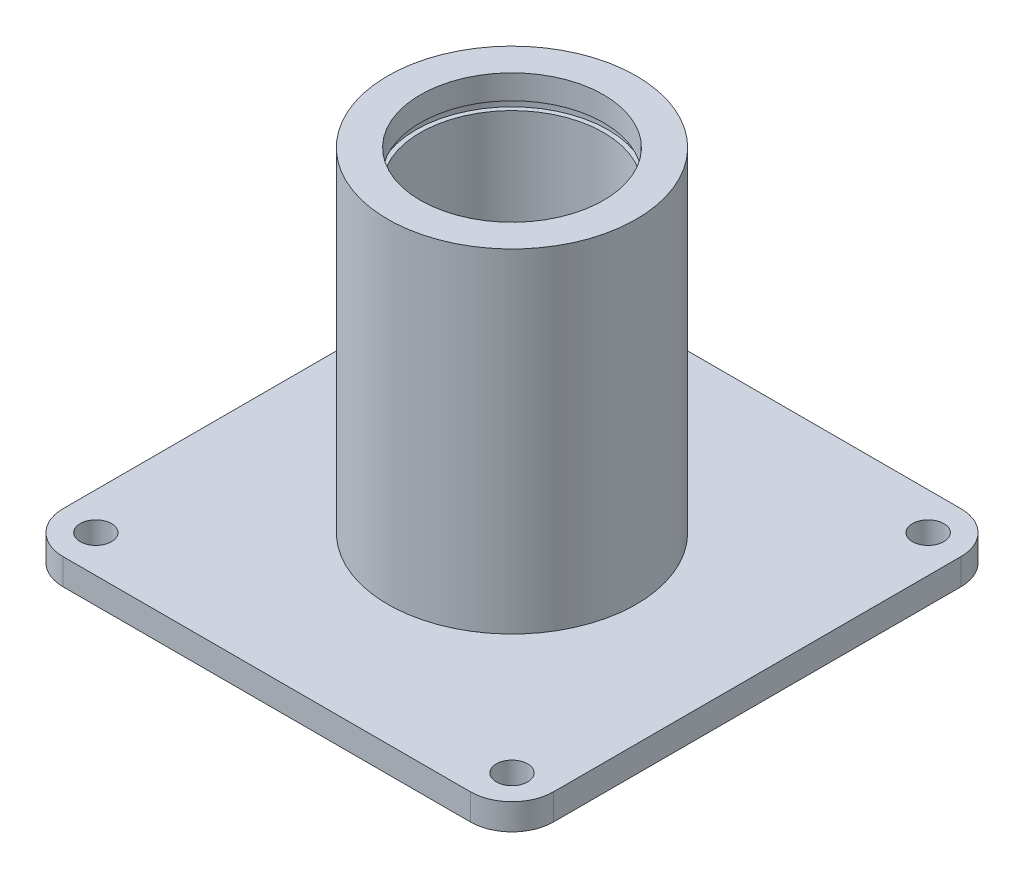
ISO-10303-21;
HEADER;
FILE_DESCRIPTION(('STEP AP214'),'2;1');
FILE_NAME('part.step','',(''),(''),'','','');
FILE_SCHEMA(('AUTOMOTIVE_DESIGN { 1 0 10303 214 1 1 1 1 }'));
ENDSEC;
DATA;
#1=APPLICATION_CONTEXT('core data for automotive mechanical design processes');
#2=APPLICATION_PROTOCOL_DEFINITION('international standard','automotive_design',2000,#1);
#3=PRODUCT_CONTEXT('',#1,'mechanical');
#4=PRODUCT('Part','Part','',(#3));
#5=PRODUCT_RELATED_PRODUCT_CATEGORY('part','',(#4));
#6=PRODUCT_DEFINITION_FORMATION('','',#4);
#7=PRODUCT_DEFINITION_CONTEXT('part definition',#1,'design');
#8=PRODUCT_DEFINITION('design','',#6,#7);
#9=PRODUCT_DEFINITION_SHAPE('','',#8);
#10=(LENGTH_UNIT() NAMED_UNIT(*) SI_UNIT(.MILLI.,.METRE.));
#11=(NAMED_UNIT(*) PLANE_ANGLE_UNIT() SI_UNIT($,.RADIAN.));
#12=(NAMED_UNIT(*) SI_UNIT($,.STERADIAN.) SOLID_ANGLE_UNIT());
#13=UNCERTAINTY_MEASURE_WITH_UNIT(LENGTH_MEASURE(1.E-05),#10,'distance_accuracy_value','');
#14=(GEOMETRIC_REPRESENTATION_CONTEXT(3) GLOBAL_UNCERTAINTY_ASSIGNED_CONTEXT((#13)) GLOBAL_UNIT_ASSIGNED_CONTEXT((#10,
#11,#12)) REPRESENTATION_CONTEXT('',''));
#15=CARTESIAN_POINT('',(0.,0.,0.));
#16=DIRECTION('',(0.,0.,1.));
#17=DIRECTION('',(1.,0.,0.));
#18=AXIS2_PLACEMENT_3D('',#15,#16,#17);
#19=CARTESIAN_POINT('',(-12.,0.,0.));
#20=DIRECTION('',(0.,1.,0.));
#21=DIRECTION('',(0.,0.,1.));
#22=AXIS2_PLACEMENT_3D('',#19,#20,#21);
#23=PLANE('',#22);
#24=CARTESIAN_POINT('',(31.8198051533946,0.,-31.8198051533946));
#25=DIRECTION('',(0.,-1.,0.));
#26=DIRECTION('',(0.,0.,-1.));
#27=AXIS2_PLACEMENT_3D('',#24,#25,#26);
#28=CIRCLE('',#27,2.4);
#29=CARTESIAN_POINT('',(31.8198051533946,0.,-34.2198051533946));
#30=VERTEX_POINT('',#29);
#31=EDGE_CURVE('E346',#30,#30,#28,.T.);
#32=ORIENTED_EDGE('',*,*,#31,.F.);
#33=EDGE_LOOP('',(#32));
#34=FACE_BOUND('',#33,.T.);
#35=CARTESIAN_POINT('',(-31.8198051533947,0.,-31.8198051533946));
#36=DIRECTION('',(0.,-1.,0.));
#37=DIRECTION('',(0.,0.,-1.));
#38=AXIS2_PLACEMENT_3D('',#35,#36,#37);
#39=CIRCLE('',#38,2.4);
#40=CARTESIAN_POINT('',(-31.8198051533947,0.,-34.2198051533946));
#41=VERTEX_POINT('',#40);
#42=EDGE_CURVE('E338',#41,#41,#39,.T.);
#43=ORIENTED_EDGE('',*,*,#42,.F.);
#44=EDGE_LOOP('',(#43));
#45=FACE_BOUND('',#44,.T.);
#46=CARTESIAN_POINT('',(-31.8198051533947,0.,31.8198051533946));
#47=DIRECTION('',(0.,-1.,0.));
#48=DIRECTION('',(0.,0.,-1.));
#49=AXIS2_PLACEMENT_3D('',#46,#47,#48);
#50=CIRCLE('',#49,2.4);
#51=CARTESIAN_POINT('',(-31.8198051533947,0.,29.4198051533946));
#52=VERTEX_POINT('',#51);
#53=EDGE_CURVE('E330',#52,#52,#50,.T.);
#54=ORIENTED_EDGE('',*,*,#53,.F.);
#55=EDGE_LOOP('',(#54));
#56=FACE_BOUND('',#55,.T.);
#57=CARTESIAN_POINT('',(0.,0.,0.));
#58=DIRECTION('',(0.,-1.,0.));
#59=DIRECTION('',(0.,0.,-1.));
#60=AXIS2_PLACEMENT_3D('',#57,#58,#59);
#61=CIRCLE('',#60,12.);
#62=CARTESIAN_POINT('',(0.,0.,-12.));
#63=VERTEX_POINT('',#62);
#64=EDGE_CURVE('E213',#63,#63,#61,.T.);
#65=ORIENTED_EDGE('',*,*,#64,.F.);
#66=EDGE_LOOP('',(#65));
#67=FACE_BOUND('',#66,.T.);
#68=DIRECTION('',(0.,0.,1.));
#69=VECTOR('',#68,1.);
#70=CARTESIAN_POINT('',(37.5,0.,37.5));
#71=LINE('',#70,#69);
#72=CARTESIAN_POINT('',(37.5,0.,-31.15));
#73=VERTEX_POINT('',#72);
#74=CARTESIAN_POINT('',(37.5,0.,31.15));
#75=VERTEX_POINT('',#74);
#76=EDGE_CURVE('E111',#73,#75,#71,.T.);
#77=ORIENTED_EDGE('',*,*,#76,.T.);
#78=CARTESIAN_POINT('',(31.15,0.,31.15));
#79=DIRECTION('',(0.,1.,0.));
#80=DIRECTION('',(0.,0.,1.));
#81=AXIS2_PLACEMENT_3D('',#78,#79,#80);
#82=CIRCLE('',#81,6.35);
#83=CARTESIAN_POINT('',(31.15,0.,37.5));
#84=VERTEX_POINT('',#83);
#85=EDGE_CURVE('E105',#75,#84,#82,.F.);
#86=ORIENTED_EDGE('',*,*,#85,.T.);
#87=DIRECTION('',(-1.,0.,0.));
#88=VECTOR('',#87,1.);
#89=CARTESIAN_POINT('',(37.5,0.,37.5));
#90=LINE('',#89,#88);
#91=CARTESIAN_POINT('',(-31.15,0.,37.5));
#92=VERTEX_POINT('',#91);
#93=EDGE_CURVE('E108',#84,#92,#90,.T.);
#94=ORIENTED_EDGE('',*,*,#93,.T.);
#95=CARTESIAN_POINT('',(-31.15,0.,31.15));
#96=DIRECTION('',(0.,1.,0.));
#97=DIRECTION('',(0.,0.,1.));
#98=AXIS2_PLACEMENT_3D('',#95,#96,#97);
#99=CIRCLE('',#98,6.35);
#100=CARTESIAN_POINT('',(-37.5,0.,31.15));
#101=VERTEX_POINT('',#100);
#102=EDGE_CURVE('E117',#92,#101,#99,.F.);
#103=ORIENTED_EDGE('',*,*,#102,.T.);
#104=DIRECTION('',(0.,0.,-1.));
#105=VECTOR('',#104,1.);
#106=CARTESIAN_POINT('',(-37.5,0.,37.5));
#107=LINE('',#106,#105);
#108=CARTESIAN_POINT('',(-37.5,0.,-31.15));
#109=VERTEX_POINT('',#108);
#110=EDGE_CURVE('E129',#101,#109,#107,.T.);
#111=ORIENTED_EDGE('',*,*,#110,.T.);
#112=CARTESIAN_POINT('',(-31.15,0.,-31.15));
#113=DIRECTION('',(0.,1.,0.));
#114=DIRECTION('',(0.,0.,1.));
#115=AXIS2_PLACEMENT_3D('',#112,#113,#114);
#116=CIRCLE('',#115,6.35);
#117=CARTESIAN_POINT('',(-31.15,0.,-37.5));
#118=VERTEX_POINT('',#117);
#119=EDGE_CURVE('E60',#109,#118,#116,.F.);
#120=ORIENTED_EDGE('',*,*,#119,.T.);
#121=DIRECTION('',(1.,0.,0.));
#122=VECTOR('',#121,1.);
#123=CARTESIAN_POINT('',(37.5,0.,-37.5));
#124=LINE('',#123,#122);
#125=CARTESIAN_POINT('',(31.15,0.,-37.5));
#126=VERTEX_POINT('',#125);
#127=EDGE_CURVE('E176',#118,#126,#124,.T.);
#128=ORIENTED_EDGE('',*,*,#127,.T.);
#129=CARTESIAN_POINT('',(31.15,0.,-31.15));
#130=DIRECTION('',(0.,1.,0.));
#131=DIRECTION('',(0.,0.,1.));
#132=AXIS2_PLACEMENT_3D('',#129,#130,#131);
#133=CIRCLE('',#132,6.35);
#134=EDGE_CURVE('E160',#126,#73,#133,.F.);
#135=ORIENTED_EDGE('',*,*,#134,.T.);
#136=EDGE_LOOP('',(#77,#86,#94,#103,#111,#120,#128,#135));
#137=FACE_BOUND('',#136,.T.);
#138=CARTESIAN_POINT('',(31.8198051533946,0.,31.8198051533946));
#139=DIRECTION('',(0.,-1.,0.));
#140=DIRECTION('',(0.,0.,-1.));
#141=AXIS2_PLACEMENT_3D('',#138,#139,#140);
#142=CIRCLE('',#141,2.4);
#143=CARTESIAN_POINT('',(31.8198051533946,0.,29.4198051533946));
#144=VERTEX_POINT('',#143);
#145=EDGE_CURVE('E322',#144,#144,#142,.T.);
#146=ORIENTED_EDGE('',*,*,#145,.F.);
#147=EDGE_LOOP('',(#146));
#148=FACE_BOUND('',#147,.T.);
#149=ADVANCED_FACE('F39',(#34,#45,#56,#67,#137,#148),#23,.F.);
#150=CARTESIAN_POINT('',(-14.,51.3,0.));
#151=DIRECTION('',(0.,1.,0.));
#152=DIRECTION('',(0.,0.,1.));
#153=AXIS2_PLACEMENT_3D('',#150,#151,#152);
#154=PLANE('',#153);
#155=CARTESIAN_POINT('',(0.,51.3,0.));
#156=DIRECTION('',(0.,-1.,0.));
#157=DIRECTION('',(0.,0.,-1.));
#158=AXIS2_PLACEMENT_3D('',#155,#156,#157);
#159=CIRCLE('',#158,14.);
#160=CARTESIAN_POINT('',(0.,51.3,-14.));
#161=VERTEX_POINT('',#160);
#162=EDGE_CURVE('E140',#161,#161,#159,.T.);
#163=ORIENTED_EDGE('',*,*,#162,.F.);
#164=EDGE_LOOP('',(#163));
#165=FACE_BOUND('',#164,.T.);
#166=CARTESIAN_POINT('',(0.,51.3,0.));
#167=DIRECTION('',(0.,-1.,0.));
#168=DIRECTION('',(0.,0.,-1.));
#169=AXIS2_PLACEMENT_3D('',#166,#167,#168);
#170=CIRCLE('',#169,14.7);
#171=CARTESIAN_POINT('',(0.,51.3,-14.7));
#172=VERTEX_POINT('',#171);
#173=EDGE_CURVE('E128',#172,#172,#170,.T.);
#174=ORIENTED_EDGE('',*,*,#173,.T.);
#175=EDGE_LOOP('',(#174));
#176=FACE_BOUND('',#175,.T.);
#177=ADVANCED_FACE('F234',(#165,#176),#154,.F.);
#178=CARTESIAN_POINT('',(0.,0.,0.));
#179=DIRECTION('',(0.,-1.,0.));
#180=DIRECTION('',(0.,0.,-1.));
#181=AXIS2_PLACEMENT_3D('',#178,#179,#180);
#182=CYLINDRICAL_SURFACE('',#181,14.);
#183=CARTESIAN_POINT('',(0.,55.,0.));
#184=DIRECTION('',(0.,-1.,0.));
#185=DIRECTION('',(0.,0.,-1.));
#186=AXIS2_PLACEMENT_3D('',#183,#184,#185);
#187=CIRCLE('',#186,14.);
#188=CARTESIAN_POINT('',(0.,55.,-14.));
#189=VERTEX_POINT('',#188);
#190=EDGE_CURVE('E225',#189,#189,#187,.T.);
#191=ORIENTED_EDGE('',*,*,#190,.F.);
#192=EDGE_LOOP('',(#191));
#193=FACE_BOUND('',#192,.T.);
#194=ORIENTED_EDGE('',*,*,#162,.T.);
#195=EDGE_LOOP('',(#194));
#196=FACE_BOUND('',#195,.T.);
#197=ADVANCED_FACE('F232',(#193,#196),#182,.F.);
#198=CARTESIAN_POINT('',(-19.,55.,0.));
#199=DIRECTION('',(0.,-1.,0.));
#200=DIRECTION('',(0.,0.,-1.));
#201=AXIS2_PLACEMENT_3D('',#198,#199,#200);
#202=PLANE('',#201);
#203=CARTESIAN_POINT('',(0.,55.,0.));
#204=DIRECTION('',(0.,-1.,0.));
#205=DIRECTION('',(0.,0.,-1.));
#206=AXIS2_PLACEMENT_3D('',#203,#204,#205);
#207=CIRCLE('',#206,19.);
#208=CARTESIAN_POINT('',(0.,55.,-19.));
#209=VERTEX_POINT('',#208);
#210=EDGE_CURVE('E221',#209,#209,#207,.T.);
#211=ORIENTED_EDGE('',*,*,#210,.F.);
#212=EDGE_LOOP('',(#211));
#213=FACE_BOUND('',#212,.T.);
#214=ORIENTED_EDGE('',*,*,#190,.T.);
#215=EDGE_LOOP('',(#214));
#216=FACE_BOUND('',#215,.T.);
#217=ADVANCED_FACE('F284',(#213,#216),#202,.F.);
#218=CARTESIAN_POINT('',(0.,0.,0.));
#219=DIRECTION('',(0.,-1.,0.));
#220=DIRECTION('',(0.,0.,-1.));
#221=AXIS2_PLACEMENT_3D('',#218,#219,#220);
#222=CYLINDRICAL_SURFACE('',#221,19.);
#223=CARTESIAN_POINT('',(0.,4.,0.));
#224=DIRECTION('',(0.,-1.,0.));
#225=DIRECTION('',(0.,0.,-1.));
#226=AXIS2_PLACEMENT_3D('',#223,#224,#225);
#227=CIRCLE('',#226,19.);
#228=CARTESIAN_POINT('',(0.,4.,-19.));
#229=VERTEX_POINT('',#228);
#230=EDGE_CURVE('E217',#229,#229,#227,.T.);
#231=ORIENTED_EDGE('',*,*,#230,.F.);
#232=EDGE_LOOP('',(#231));
#233=FACE_BOUND('',#232,.T.);
#234=ORIENTED_EDGE('',*,*,#210,.T.);
#235=EDGE_LOOP('',(#234));
#236=FACE_BOUND('',#235,.T.);
#237=ADVANCED_FACE('F280',(#233,#236),#222,.T.);
#238=CARTESIAN_POINT('',(-29.,4.,0.));
#239=DIRECTION('',(0.,-1.,0.));
#240=DIRECTION('',(0.,0.,-1.));
#241=AXIS2_PLACEMENT_3D('',#238,#239,#240);
#242=PLANE('',#241);
#243=CARTESIAN_POINT('',(31.8198051533946,4.,-31.8198051533946));
#244=DIRECTION('',(0.,-1.,0.));
#245=DIRECTION('',(0.,0.,-1.));
#246=AXIS2_PLACEMENT_3D('',#243,#244,#245);
#247=CIRCLE('',#246,2.4);
#248=CARTESIAN_POINT('',(31.8198051533946,4.,-34.2198051533946));
#249=VERTEX_POINT('',#248);
#250=EDGE_CURVE('E342',#249,#249,#247,.T.);
#251=ORIENTED_EDGE('',*,*,#250,.T.);
#252=EDGE_LOOP('',(#251));
#253=FACE_BOUND('',#252,.T.);
#254=CARTESIAN_POINT('',(-31.8198051533947,4.,-31.8198051533946));
#255=DIRECTION('',(0.,-1.,0.));
#256=DIRECTION('',(0.,0.,-1.));
#257=AXIS2_PLACEMENT_3D('',#254,#255,#256);
#258=CIRCLE('',#257,2.4);
#259=CARTESIAN_POINT('',(-31.8198051533947,4.,-34.2198051533946));
#260=VERTEX_POINT('',#259);
#261=EDGE_CURVE('E334',#260,#260,#258,.T.);
#262=ORIENTED_EDGE('',*,*,#261,.T.);
#263=EDGE_LOOP('',(#262));
#264=FACE_BOUND('',#263,.T.);
#265=CARTESIAN_POINT('',(-31.8198051533947,4.,31.8198051533946));
#266=DIRECTION('',(0.,-1.,0.));
#267=DIRECTION('',(0.,0.,-1.));
#268=AXIS2_PLACEMENT_3D('',#265,#266,#267);
#269=CIRCLE('',#268,2.4);
#270=CARTESIAN_POINT('',(-31.8198051533947,4.,29.4198051533946));
#271=VERTEX_POINT('',#270);
#272=EDGE_CURVE('E326',#271,#271,#269,.T.);
#273=ORIENTED_EDGE('',*,*,#272,.T.);
#274=EDGE_LOOP('',(#273));
#275=FACE_BOUND('',#274,.T.);
#276=CARTESIAN_POINT('',(31.8198051533946,4.,31.8198051533946));
#277=DIRECTION('',(0.,-1.,0.));
#278=DIRECTION('',(0.,0.,-1.));
#279=AXIS2_PLACEMENT_3D('',#276,#277,#278);
#280=CIRCLE('',#279,2.4);
#281=CARTESIAN_POINT('',(31.8198051533946,4.,29.4198051533946));
#282=VERTEX_POINT('',#281);
#283=EDGE_CURVE('E312',#282,#282,#280,.T.);
#284=ORIENTED_EDGE('',*,*,#283,.T.);
#285=EDGE_LOOP('',(#284));
#286=FACE_BOUND('',#285,.T.);
#287=DIRECTION('',(1.,0.,0.));
#288=VECTOR('',#287,1.);
#289=CARTESIAN_POINT('',(37.5,4.,37.5));
#290=LINE('',#289,#288);
#291=CARTESIAN_POINT('',(-31.15,4.,37.5));
#292=VERTEX_POINT('',#291);
#293=CARTESIAN_POINT('',(31.15,4.,37.5));
#294=VERTEX_POINT('',#293);
#295=EDGE_CURVE('E190',#292,#294,#290,.T.);
#296=ORIENTED_EDGE('',*,*,#295,.T.);
#297=CARTESIAN_POINT('',(31.15,4.,31.15));
#298=DIRECTION('',(0.,-1.,0.));
#299=DIRECTION('',(0.,0.,-1.));
#300=AXIS2_PLACEMENT_3D('',#297,#298,#299);
#301=CIRCLE('',#300,6.35);
#302=CARTESIAN_POINT('',(37.5,4.,31.15));
#303=VERTEX_POINT('',#302);
#304=EDGE_CURVE('E132',#294,#303,#301,.F.);
#305=ORIENTED_EDGE('',*,*,#304,.T.);
#306=DIRECTION('',(0.,0.,-1.));
#307=VECTOR('',#306,1.);
#308=CARTESIAN_POINT('',(37.5,4.,37.5));
#309=LINE('',#308,#307);
#310=CARTESIAN_POINT('',(37.5,4.,-31.15));
#311=VERTEX_POINT('',#310);
#312=EDGE_CURVE('E185',#303,#311,#309,.T.);
#313=ORIENTED_EDGE('',*,*,#312,.T.);
#314=CARTESIAN_POINT('',(31.15,4.,-31.15));
#315=DIRECTION('',(0.,-1.,0.));
#316=DIRECTION('',(0.,0.,-1.));
#317=AXIS2_PLACEMENT_3D('',#314,#315,#316);
#318=CIRCLE('',#317,6.35);
#319=CARTESIAN_POINT('',(31.15,4.,-37.5));
#320=VERTEX_POINT('',#319);
#321=EDGE_CURVE('E138',#311,#320,#318,.F.);
#322=ORIENTED_EDGE('',*,*,#321,.T.);
#323=DIRECTION('',(-1.,0.,0.));
#324=VECTOR('',#323,1.);
#325=CARTESIAN_POINT('',(37.5,4.,-37.5));
#326=LINE('',#325,#324);
#327=CARTESIAN_POINT('',(-31.15,4.,-37.5));
#328=VERTEX_POINT('',#327);
#329=EDGE_CURVE('E175',#320,#328,#326,.T.);
#330=ORIENTED_EDGE('',*,*,#329,.T.);
#331=CARTESIAN_POINT('',(-31.15,4.,-31.15));
#332=DIRECTION('',(0.,-1.,0.));
#333=DIRECTION('',(0.,0.,-1.));
#334=AXIS2_PLACEMENT_3D('',#331,#332,#333);
#335=CIRCLE('',#334,6.35);
#336=CARTESIAN_POINT('',(-37.5,4.,-31.15));
#337=VERTEX_POINT('',#336);
#338=EDGE_CURVE('E134',#328,#337,#335,.F.);
#339=ORIENTED_EDGE('',*,*,#338,.T.);
#340=DIRECTION('',(0.,0.,1.));
#341=VECTOR('',#340,1.);
#342=CARTESIAN_POINT('',(-37.5,4.,37.5));
#343=LINE('',#342,#341);
#344=CARTESIAN_POINT('',(-37.5,4.,31.15));
#345=VERTEX_POINT('',#344);
#346=EDGE_CURVE('E310',#337,#345,#343,.T.);
#347=ORIENTED_EDGE('',*,*,#346,.T.);
#348=CARTESIAN_POINT('',(-31.15,4.,31.15));
#349=DIRECTION('',(0.,-1.,0.));
#350=DIRECTION('',(0.,0.,-1.));
#351=AXIS2_PLACEMENT_3D('',#348,#349,#350);
#352=CIRCLE('',#351,6.35);
#353=EDGE_CURVE('E146',#345,#292,#352,.F.);
#354=ORIENTED_EDGE('',*,*,#353,.T.);
#355=EDGE_LOOP('',(#296,#305,#313,#322,#330,#339,#347,#354));
#356=FACE_BOUND('',#355,.T.);
#357=ORIENTED_EDGE('',*,*,#230,.T.);
#358=EDGE_LOOP('',(#357));
#359=FACE_BOUND('',#358,.T.);
#360=ADVANCED_FACE('F179',(#253,#264,#275,#286,#356,#359),#242,.F.);
#361=CARTESIAN_POINT('',(0.,0.,0.));
#362=DIRECTION('',(0.,-1.,0.));
#363=DIRECTION('',(0.,0.,-1.));
#364=AXIS2_PLACEMENT_3D('',#361,#362,#363);
#365=CYLINDRICAL_SURFACE('',#364,12.);
#366=CARTESIAN_POINT('',(0.,30.,0.));
#367=DIRECTION('',(0.,-1.,0.));
#368=DIRECTION('',(0.,0.,-1.));
#369=AXIS2_PLACEMENT_3D('',#366,#367,#368);
#370=CIRCLE('',#369,12.);
#371=CARTESIAN_POINT('',(0.,30.,-12.));
#372=VERTEX_POINT('',#371);
#373=EDGE_CURVE('E209',#372,#372,#370,.T.);
#374=ORIENTED_EDGE('',*,*,#373,.F.);
#375=EDGE_LOOP('',(#374));
#376=FACE_BOUND('',#375,.T.);
#377=ORIENTED_EDGE('',*,*,#64,.T.);
#378=EDGE_LOOP('',(#377));
#379=FACE_BOUND('',#378,.T.);
#380=ADVANCED_FACE('F261',(#376,#379),#365,.F.);
#381=CARTESIAN_POINT('',(-14.,30.,0.));
#382=DIRECTION('',(0.,-1.,0.));
#383=DIRECTION('',(0.,0.,-1.));
#384=AXIS2_PLACEMENT_3D('',#381,#382,#383);
#385=PLANE('',#384);
#386=CARTESIAN_POINT('',(0.,30.,0.));
#387=DIRECTION('',(0.,-1.,0.));
#388=DIRECTION('',(0.,0.,-1.));
#389=AXIS2_PLACEMENT_3D('',#386,#387,#388);
#390=CIRCLE('',#389,14.);
#391=CARTESIAN_POINT('',(0.,30.,-14.));
#392=VERTEX_POINT('',#391);
#393=EDGE_CURVE('E205',#392,#392,#390,.T.);
#394=ORIENTED_EDGE('',*,*,#393,.F.);
#395=EDGE_LOOP('',(#394));
#396=FACE_BOUND('',#395,.T.);
#397=ORIENTED_EDGE('',*,*,#373,.T.);
#398=EDGE_LOOP('',(#397));
#399=FACE_BOUND('',#398,.T.);
#400=ADVANCED_FACE('F255',(#396,#399),#385,.F.);
#401=CARTESIAN_POINT('',(0.,0.,0.));
#402=DIRECTION('',(0.,-1.,0.));
#403=DIRECTION('',(0.,0.,-1.));
#404=AXIS2_PLACEMENT_3D('',#401,#402,#403);
#405=CYLINDRICAL_SURFACE('',#404,14.);
#406=CARTESIAN_POINT('',(0.,50.,0.));
#407=DIRECTION('',(0.,-1.,0.));
#408=DIRECTION('',(0.,0.,-1.));
#409=AXIS2_PLACEMENT_3D('',#406,#407,#408);
#410=CIRCLE('',#409,14.);
#411=CARTESIAN_POINT('',(0.,50.,-14.));
#412=VERTEX_POINT('',#411);
#413=EDGE_CURVE('E201',#412,#412,#410,.T.);
#414=ORIENTED_EDGE('',*,*,#413,.F.);
#415=EDGE_LOOP('',(#414));
#416=FACE_BOUND('',#415,.T.);
#417=ORIENTED_EDGE('',*,*,#393,.T.);
#418=EDGE_LOOP('',(#417));
#419=FACE_BOUND('',#418,.T.);
#420=ADVANCED_FACE('F249',(#416,#419),#405,.F.);
#421=CARTESIAN_POINT('',(-14.,50.,0.));
#422=DIRECTION('',(0.,-1.,0.));
#423=DIRECTION('',(0.,0.,-1.));
#424=AXIS2_PLACEMENT_3D('',#421,#422,#423);
#425=PLANE('',#424);
#426=CARTESIAN_POINT('',(0.,50.,0.));
#427=DIRECTION('',(0.,-1.,0.));
#428=DIRECTION('',(0.,0.,-1.));
#429=AXIS2_PLACEMENT_3D('',#426,#427,#428);
#430=CIRCLE('',#429,14.7);
#431=CARTESIAN_POINT('',(0.,50.,-14.7));
#432=VERTEX_POINT('',#431);
#433=EDGE_CURVE('E197',#432,#432,#430,.T.);
#434=ORIENTED_EDGE('',*,*,#433,.F.);
#435=EDGE_LOOP('',(#434));
#436=FACE_BOUND('',#435,.T.);
#437=ORIENTED_EDGE('',*,*,#413,.T.);
#438=EDGE_LOOP('',(#437));
#439=FACE_BOUND('',#438,.T.);
#440=ADVANCED_FACE('F243',(#436,#439),#425,.F.);
#441=CARTESIAN_POINT('',(0.,0.,0.));
#442=DIRECTION('',(0.,-1.,0.));
#443=DIRECTION('',(0.,0.,-1.));
#444=AXIS2_PLACEMENT_3D('',#441,#442,#443);
#445=CYLINDRICAL_SURFACE('',#444,14.7);
#446=ORIENTED_EDGE('',*,*,#173,.F.);
#447=EDGE_LOOP('',(#446));
#448=FACE_BOUND('',#447,.T.);
#449=ORIENTED_EDGE('',*,*,#433,.T.);
#450=EDGE_LOOP('',(#449));
#451=FACE_BOUND('',#450,.T.);
#452=ADVANCED_FACE('F240',(#448,#451),#445,.F.);
#453=CARTESIAN_POINT('',(37.5,-106.066017177982,37.5));
#454=DIRECTION('',(0.,0.,1.));
#455=DIRECTION('',(1.,0.,0.));
#456=AXIS2_PLACEMENT_3D('',#453,#454,#455);
#457=PLANE('',#456);
#458=ORIENTED_EDGE('',*,*,#93,.F.);
#459=DIRECTION('',(0.,1.,0.));
#460=VECTOR('',#459,1.);
#461=CARTESIAN_POINT('',(31.15,-106.066017177982,37.5));
#462=LINE('',#461,#460);
#463=EDGE_CURVE('E123',#84,#294,#462,.T.);
#464=ORIENTED_EDGE('',*,*,#463,.T.);
#465=ORIENTED_EDGE('',*,*,#295,.F.);
#466=DIRECTION('',(0.,1.,0.));
#467=VECTOR('',#466,1.);
#468=CARTESIAN_POINT('',(-31.15,-106.066017177982,37.5));
#469=LINE('',#468,#467);
#470=EDGE_CURVE('E126',#292,#92,#469,.F.);
#471=ORIENTED_EDGE('',*,*,#470,.T.);
#472=EDGE_LOOP('',(#458,#464,#465,#471));
#473=FACE_BOUND('',#472,.T.);
#474=ADVANCED_FACE('F121',(#473),#457,.T.);
#475=CARTESIAN_POINT('',(37.5,-106.066017177982,37.5));
#476=DIRECTION('',(1.,0.,0.));
#477=DIRECTION('',(0.,0.,-1.));
#478=AXIS2_PLACEMENT_3D('',#475,#476,#477);
#479=PLANE('',#478);
#480=ORIENTED_EDGE('',*,*,#312,.F.);
#481=DIRECTION('',(0.,1.,0.));
#482=VECTOR('',#481,1.);
#483=CARTESIAN_POINT('',(37.5,-106.066017177982,31.15));
#484=LINE('',#483,#482);
#485=EDGE_CURVE('E155',#303,#75,#484,.F.);
#486=ORIENTED_EDGE('',*,*,#485,.T.);
#487=ORIENTED_EDGE('',*,*,#76,.F.);
#488=DIRECTION('',(0.,1.,0.));
#489=VECTOR('',#488,1.);
#490=CARTESIAN_POINT('',(37.5,-106.066017177982,-31.15));
#491=LINE('',#490,#489);
#492=EDGE_CURVE('E151',#73,#311,#491,.T.);
#493=ORIENTED_EDGE('',*,*,#492,.T.);
#494=EDGE_LOOP('',(#480,#486,#487,#493));
#495=FACE_BOUND('',#494,.T.);
#496=ADVANCED_FACE('F308',(#495),#479,.T.);
#497=CARTESIAN_POINT('',(37.5,-106.066017177982,-37.5));
#498=DIRECTION('',(0.,0.,-1.));
#499=DIRECTION('',(-1.,0.,0.));
#500=AXIS2_PLACEMENT_3D('',#497,#498,#499);
#501=PLANE('',#500);
#502=ORIENTED_EDGE('',*,*,#329,.F.);
#503=DIRECTION('',(0.,1.,0.));
#504=VECTOR('',#503,1.);
#505=CARTESIAN_POINT('',(31.15,-106.066017177982,-37.5));
#506=LINE('',#505,#504);
#507=EDGE_CURVE('E11',#320,#126,#506,.F.);
#508=ORIENTED_EDGE('',*,*,#507,.T.);
#509=ORIENTED_EDGE('',*,*,#127,.F.);
#510=DIRECTION('',(0.,1.,0.));
#511=VECTOR('',#510,1.);
#512=CARTESIAN_POINT('',(-31.15,-106.066017177982,-37.5));
#513=LINE('',#512,#511);
#514=EDGE_CURVE('E48',#118,#328,#513,.T.);
#515=ORIENTED_EDGE('',*,*,#514,.T.);
#516=EDGE_LOOP('',(#502,#508,#509,#515));
#517=FACE_BOUND('',#516,.T.);
#518=ADVANCED_FACE('F174',(#517),#501,.T.);
#519=CARTESIAN_POINT('',(-37.5,-106.066017177982,37.5));
#520=DIRECTION('',(-1.,0.,0.));
#521=DIRECTION('',(0.,0.,1.));
#522=AXIS2_PLACEMENT_3D('',#519,#520,#521);
#523=PLANE('',#522);
#524=ORIENTED_EDGE('',*,*,#110,.F.);
#525=DIRECTION('',(0.,1.,0.));
#526=VECTOR('',#525,1.);
#527=CARTESIAN_POINT('',(-37.5,-106.066017177982,31.15));
#528=LINE('',#527,#526);
#529=EDGE_CURVE('E167',#101,#345,#528,.T.);
#530=ORIENTED_EDGE('',*,*,#529,.T.);
#531=ORIENTED_EDGE('',*,*,#346,.F.);
#532=DIRECTION('',(0.,1.,0.));
#533=VECTOR('',#532,1.);
#534=CARTESIAN_POINT('',(-37.5,-106.066017177982,-31.15));
#535=LINE('',#534,#533);
#536=EDGE_CURVE('E116',#337,#109,#535,.F.);
#537=ORIENTED_EDGE('',*,*,#536,.T.);
#538=EDGE_LOOP('',(#524,#530,#531,#537));
#539=FACE_BOUND('',#538,.T.);
#540=ADVANCED_FACE('F368',(#539),#523,.T.);
#541=CARTESIAN_POINT('',(31.8198051533946,0.,31.8198051533946));
#542=DIRECTION('',(0.,-1.,0.));
#543=DIRECTION('',(0.,0.,-1.));
#544=AXIS2_PLACEMENT_3D('',#541,#542,#543);
#545=CYLINDRICAL_SURFACE('',#544,2.4);
#546=ORIENTED_EDGE('',*,*,#283,.F.);
#547=EDGE_LOOP('',(#546));
#548=FACE_BOUND('',#547,.T.);
#549=ORIENTED_EDGE('',*,*,#145,.T.);
#550=EDGE_LOOP('',(#549));
#551=FACE_BOUND('',#550,.T.);
#552=ADVANCED_FACE('F364',(#548,#551),#545,.F.);
#553=CARTESIAN_POINT('',(-31.8198051533947,0.,31.8198051533946));
#554=DIRECTION('',(0.,-1.,0.));
#555=DIRECTION('',(0.,0.,-1.));
#556=AXIS2_PLACEMENT_3D('',#553,#554,#555);
#557=CYLINDRICAL_SURFACE('',#556,2.4);
#558=ORIENTED_EDGE('',*,*,#272,.F.);
#559=EDGE_LOOP('',(#558));
#560=FACE_BOUND('',#559,.T.);
#561=ORIENTED_EDGE('',*,*,#53,.T.);
#562=EDGE_LOOP('',(#561));
#563=FACE_BOUND('',#562,.T.);
#564=ADVANCED_FACE('F357',(#560,#563),#557,.F.);
#565=CARTESIAN_POINT('',(-31.8198051533947,0.,-31.8198051533946));
#566=DIRECTION('',(0.,-1.,0.));
#567=DIRECTION('',(0.,0.,-1.));
#568=AXIS2_PLACEMENT_3D('',#565,#566,#567);
#569=CYLINDRICAL_SURFACE('',#568,2.4);
#570=ORIENTED_EDGE('',*,*,#261,.F.);
#571=EDGE_LOOP('',(#570));
#572=FACE_BOUND('',#571,.T.);
#573=ORIENTED_EDGE('',*,*,#42,.T.);
#574=EDGE_LOOP('',(#573));
#575=FACE_BOUND('',#574,.T.);
#576=ADVANCED_FACE('F351',(#572,#575),#569,.F.);
#577=CARTESIAN_POINT('',(31.8198051533946,0.,-31.8198051533946));
#578=DIRECTION('',(0.,-1.,0.));
#579=DIRECTION('',(0.,0.,-1.));
#580=AXIS2_PLACEMENT_3D('',#577,#578,#579);
#581=CYLINDRICAL_SURFACE('',#580,2.4);
#582=ORIENTED_EDGE('',*,*,#250,.F.);
#583=EDGE_LOOP('',(#582));
#584=FACE_BOUND('',#583,.T.);
#585=ORIENTED_EDGE('',*,*,#31,.T.);
#586=EDGE_LOOP('',(#585));
#587=FACE_BOUND('',#586,.T.);
#588=ADVANCED_FACE('F295',(#584,#587),#581,.F.);
#589=CARTESIAN_POINT('',(31.15,-106.066017177982,31.15));
#590=DIRECTION('',(0.,1.,0.));
#591=DIRECTION('',(0.,0.,1.));
#592=AXIS2_PLACEMENT_3D('',#589,#590,#591);
#593=CYLINDRICAL_SURFACE('',#592,6.35);
#594=ORIENTED_EDGE('',*,*,#85,.F.);
#595=ORIENTED_EDGE('',*,*,#485,.F.);
#596=ORIENTED_EDGE('',*,*,#304,.F.);
#597=ORIENTED_EDGE('',*,*,#463,.F.);
#598=EDGE_LOOP('',(#594,#595,#596,#597));
#599=FACE_BOUND('',#598,.T.);
#600=ADVANCED_FACE('F131',(#599),#593,.T.);
#601=CARTESIAN_POINT('',(-31.15,-106.066017177982,31.15));
#602=DIRECTION('',(0.,1.,0.));
#603=DIRECTION('',(0.,0.,1.));
#604=AXIS2_PLACEMENT_3D('',#601,#602,#603);
#605=CYLINDRICAL_SURFACE('',#604,6.35);
#606=ORIENTED_EDGE('',*,*,#102,.F.);
#607=ORIENTED_EDGE('',*,*,#470,.F.);
#608=ORIENTED_EDGE('',*,*,#353,.F.);
#609=ORIENTED_EDGE('',*,*,#529,.F.);
#610=EDGE_LOOP('',(#606,#607,#608,#609));
#611=FACE_BOUND('',#610,.T.);
#612=ADVANCED_FACE('F294',(#611),#605,.T.);
#613=CARTESIAN_POINT('',(31.15,-106.066017177982,-31.15));
#614=DIRECTION('',(0.,1.,0.));
#615=DIRECTION('',(0.,0.,1.));
#616=AXIS2_PLACEMENT_3D('',#613,#614,#615);
#617=CYLINDRICAL_SURFACE('',#616,6.35);
#618=ORIENTED_EDGE('',*,*,#134,.F.);
#619=ORIENTED_EDGE('',*,*,#507,.F.);
#620=ORIENTED_EDGE('',*,*,#321,.F.);
#621=ORIENTED_EDGE('',*,*,#492,.F.);
#622=EDGE_LOOP('',(#618,#619,#620,#621));
#623=FACE_BOUND('',#622,.T.);
#624=ADVANCED_FACE('F297',(#623),#617,.T.);
#625=CARTESIAN_POINT('',(-31.15,-106.066017177982,-31.15));
#626=DIRECTION('',(0.,1.,0.));
#627=DIRECTION('',(0.,0.,1.));
#628=AXIS2_PLACEMENT_3D('',#625,#626,#627);
#629=CYLINDRICAL_SURFACE('',#628,6.35);
#630=ORIENTED_EDGE('',*,*,#119,.F.);
#631=ORIENTED_EDGE('',*,*,#536,.F.);
#632=ORIENTED_EDGE('',*,*,#338,.F.);
#633=ORIENTED_EDGE('',*,*,#514,.F.);
#634=EDGE_LOOP('',(#630,#631,#632,#633));
#635=FACE_BOUND('',#634,.T.);
#636=ADVANCED_FACE('F41',(#635),#629,.T.);
#637=CLOSED_SHELL('',(#149,#177,#197,#217,#237,#360,#380,#400,#420,#440,#452,#474,#496,#518,
#540,#552,#564,#576,#588,#600,#612,#624,#636));
#638=MANIFOLD_SOLID_BREP('B2',#637);
#639=ADVANCED_BREP_SHAPE_REPRESENTATION('',(#18,#638),#14);
#640=SHAPE_DEFINITION_REPRESENTATION(#9,#639);
ENDSEC;
END-ISO-10303-21;
